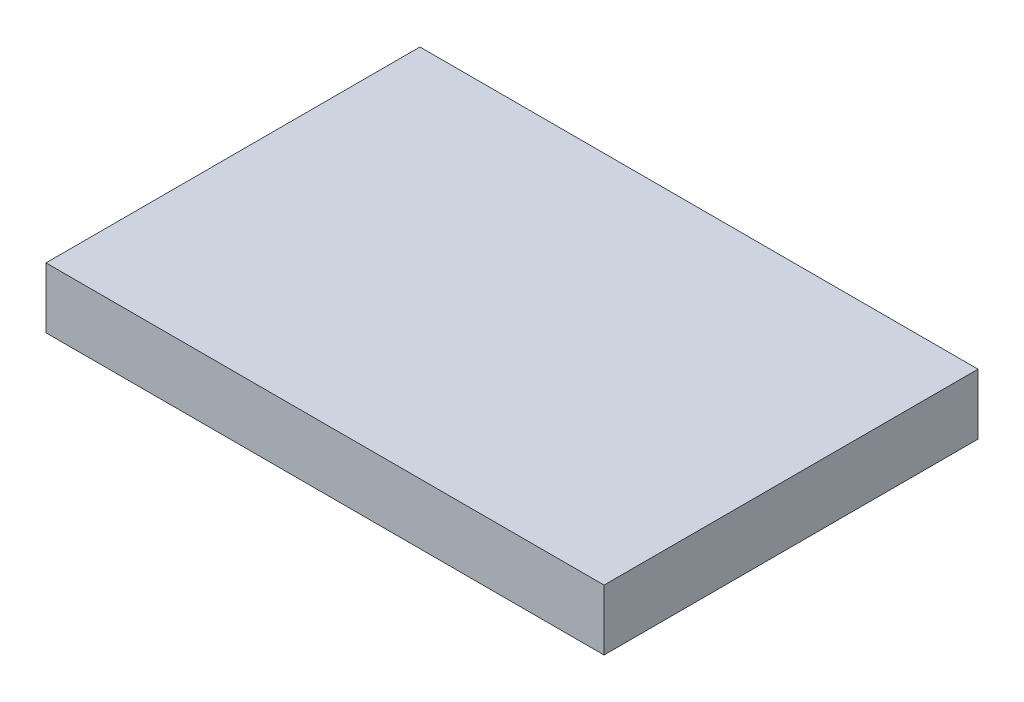
ISO-10303-21;
HEADER;
FILE_DESCRIPTION(('STEP AP214'),'2;1');
FILE_NAME('part.step','',(''),(''),'','','');
FILE_SCHEMA(('AUTOMOTIVE_DESIGN { 1 0 10303 214 1 1 1 1 }'));
ENDSEC;
DATA;
#1=APPLICATION_CONTEXT('core data for automotive mechanical design processes');
#2=APPLICATION_PROTOCOL_DEFINITION('international standard','automotive_design',2000,#1);
#3=PRODUCT_CONTEXT('',#1,'mechanical');
#4=PRODUCT('Part','Part','',(#3));
#5=PRODUCT_RELATED_PRODUCT_CATEGORY('part','',(#4));
#6=PRODUCT_DEFINITION_FORMATION('','',#4);
#7=PRODUCT_DEFINITION_CONTEXT('part definition',#1,'design');
#8=PRODUCT_DEFINITION('design','',#6,#7);
#9=PRODUCT_DEFINITION_SHAPE('','',#8);
#10=(LENGTH_UNIT() NAMED_UNIT(*) SI_UNIT(.MILLI.,.METRE.));
#11=(NAMED_UNIT(*) PLANE_ANGLE_UNIT() SI_UNIT($,.RADIAN.));
#12=(NAMED_UNIT(*) SI_UNIT($,.STERADIAN.) SOLID_ANGLE_UNIT());
#13=UNCERTAINTY_MEASURE_WITH_UNIT(LENGTH_MEASURE(1.E-05),#10,'distance_accuracy_value','');
#14=(GEOMETRIC_REPRESENTATION_CONTEXT(3) GLOBAL_UNCERTAINTY_ASSIGNED_CONTEXT((#13)) GLOBAL_UNIT_ASSIGNED_CONTEXT((#10,
#11,#12)) REPRESENTATION_CONTEXT('',''));
#15=CARTESIAN_POINT('',(0.,0.,0.));
#16=DIRECTION('',(0.,0.,1.));
#17=DIRECTION('',(1.,0.,0.));
#18=AXIS2_PLACEMENT_3D('',#15,#16,#17);
#19=CARTESIAN_POINT('',(41.45,9.,27.775));
#20=DIRECTION('',(-1.,0.,0.));
#21=DIRECTION('',(0.,0.,1.));
#22=AXIS2_PLACEMENT_3D('',#19,#20,#21);
#23=PLANE('',#22);
#24=DIRECTION('',(0.,0.,-1.));
#25=VECTOR('',#24,1.);
#26=CARTESIAN_POINT('',(41.45,0.,27.775));
#27=LINE('',#26,#25);
#28=CARTESIAN_POINT('',(41.45,0.,27.775));
#29=VERTEX_POINT('',#28);
#30=CARTESIAN_POINT('',(41.45,0.,-27.775));
#31=VERTEX_POINT('',#30);
#32=EDGE_CURVE('E111',#29,#31,#27,.T.);
#33=ORIENTED_EDGE('',*,*,#32,.T.);
#34=DIRECTION('',(0.,-1.,0.));
#35=VECTOR('',#34,1.);
#36=CARTESIAN_POINT('',(41.45,9.,-27.775));
#37=LINE('',#36,#35);
#38=CARTESIAN_POINT('',(41.45,9.,-27.775));
#39=VERTEX_POINT('',#38);
#40=EDGE_CURVE('E11',#39,#31,#37,.T.);
#41=ORIENTED_EDGE('',*,*,#40,.F.);
#42=DIRECTION('',(0.,0.,-1.));
#43=VECTOR('',#42,1.);
#44=CARTESIAN_POINT('',(41.45,9.,27.775));
#45=LINE('',#44,#43);
#46=CARTESIAN_POINT('',(41.45,9.,27.775));
#47=VERTEX_POINT('',#46);
#48=EDGE_CURVE('E95',#47,#39,#45,.T.);
#49=ORIENTED_EDGE('',*,*,#48,.F.);
#50=DIRECTION('',(0.,-1.,0.));
#51=VECTOR('',#50,1.);
#52=CARTESIAN_POINT('',(41.45,9.,27.775));
#53=LINE('',#52,#51);
#54=EDGE_CURVE('E107',#47,#29,#53,.T.);
#55=ORIENTED_EDGE('',*,*,#54,.T.);
#56=EDGE_LOOP('',(#33,#41,#49,#55));
#57=FACE_BOUND('',#56,.T.);
#58=ADVANCED_FACE('F43',(#57),#23,.F.);
#59=CARTESIAN_POINT('',(-41.45,9.,-27.775));
#60=DIRECTION('',(0.,0.,1.));
#61=DIRECTION('',(1.,0.,0.));
#62=AXIS2_PLACEMENT_3D('',#59,#60,#61);
#63=PLANE('',#62);
#64=DIRECTION('',(-1.,0.,0.));
#65=VECTOR('',#64,1.);
#66=CARTESIAN_POINT('',(-41.45,0.,-27.775));
#67=LINE('',#66,#65);
#68=CARTESIAN_POINT('',(-41.45,0.,-27.775));
#69=VERTEX_POINT('',#68);
#70=EDGE_CURVE('E100',#31,#69,#67,.T.);
#71=ORIENTED_EDGE('',*,*,#70,.T.);
#72=DIRECTION('',(0.,-1.,0.));
#73=VECTOR('',#72,1.);
#74=CARTESIAN_POINT('',(-41.45,9.,-27.775));
#75=LINE('',#74,#73);
#76=CARTESIAN_POINT('',(-41.45,9.,-27.775));
#77=VERTEX_POINT('',#76);
#78=EDGE_CURVE('E52',#77,#69,#75,.T.);
#79=ORIENTED_EDGE('',*,*,#78,.F.);
#80=DIRECTION('',(-1.,0.,0.));
#81=VECTOR('',#80,1.);
#82=CARTESIAN_POINT('',(-41.45,9.,-27.775));
#83=LINE('',#82,#81);
#84=EDGE_CURVE('E90',#39,#77,#83,.T.);
#85=ORIENTED_EDGE('',*,*,#84,.F.);
#86=ORIENTED_EDGE('',*,*,#40,.T.);
#87=EDGE_LOOP('',(#71,#79,#85,#86));
#88=FACE_BOUND('',#87,.T.);
#89=ADVANCED_FACE('F99',(#88),#63,.F.);
#90=CARTESIAN_POINT('',(-41.45,9.,27.775));
#91=DIRECTION('',(1.,0.,0.));
#92=DIRECTION('',(0.,0.,-1.));
#93=AXIS2_PLACEMENT_3D('',#90,#91,#92);
#94=PLANE('',#93);
#95=DIRECTION('',(0.,0.,1.));
#96=VECTOR('',#95,1.);
#97=CARTESIAN_POINT('',(-41.45,0.,27.775));
#98=LINE('',#97,#96);
#99=CARTESIAN_POINT('',(-41.45,0.,27.775));
#100=VERTEX_POINT('',#99);
#101=EDGE_CURVE('E77',#69,#100,#98,.T.);
#102=ORIENTED_EDGE('',*,*,#101,.T.);
#103=DIRECTION('',(0.,-1.,0.));
#104=VECTOR('',#103,1.);
#105=CARTESIAN_POINT('',(-41.45,9.,27.775));
#106=LINE('',#105,#104);
#107=CARTESIAN_POINT('',(-41.45,9.,27.775));
#108=VERTEX_POINT('',#107);
#109=EDGE_CURVE('E102',#108,#100,#106,.T.);
#110=ORIENTED_EDGE('',*,*,#109,.F.);
#111=DIRECTION('',(0.,0.,1.));
#112=VECTOR('',#111,1.);
#113=CARTESIAN_POINT('',(-41.45,9.,27.775));
#114=LINE('',#113,#112);
#115=EDGE_CURVE('E93',#77,#108,#114,.T.);
#116=ORIENTED_EDGE('',*,*,#115,.F.);
#117=ORIENTED_EDGE('',*,*,#78,.T.);
#118=EDGE_LOOP('',(#102,#110,#116,#117));
#119=FACE_BOUND('',#118,.T.);
#120=ADVANCED_FACE('F103',(#119),#94,.F.);
#121=CARTESIAN_POINT('',(-41.45,9.,27.775));
#122=DIRECTION('',(0.,0.,-1.));
#123=DIRECTION('',(-1.,0.,0.));
#124=AXIS2_PLACEMENT_3D('',#121,#122,#123);
#125=PLANE('',#124);
#126=DIRECTION('',(1.,0.,0.));
#127=VECTOR('',#126,1.);
#128=CARTESIAN_POINT('',(-41.45,0.,27.775));
#129=LINE('',#128,#127);
#130=EDGE_CURVE('E83',#100,#29,#129,.T.);
#131=ORIENTED_EDGE('',*,*,#130,.T.);
#132=ORIENTED_EDGE('',*,*,#54,.F.);
#133=DIRECTION('',(1.,0.,0.));
#134=VECTOR('',#133,1.);
#135=CARTESIAN_POINT('',(-41.45,9.,27.775));
#136=LINE('',#135,#134);
#137=EDGE_CURVE('E60',#108,#47,#136,.T.);
#138=ORIENTED_EDGE('',*,*,#137,.F.);
#139=ORIENTED_EDGE('',*,*,#109,.T.);
#140=EDGE_LOOP('',(#131,#132,#138,#139));
#141=FACE_BOUND('',#140,.T.);
#142=ADVANCED_FACE('F124',(#141),#125,.F.);
#143=CARTESIAN_POINT('',(0.,9.,0.));
#144=DIRECTION('',(0.,-1.,0.));
#145=DIRECTION('',(0.,0.,-1.));
#146=AXIS2_PLACEMENT_3D('',#143,#144,#145);
#147=PLANE('',#146);
#148=ORIENTED_EDGE('',*,*,#48,.T.);
#149=ORIENTED_EDGE('',*,*,#84,.T.);
#150=ORIENTED_EDGE('',*,*,#115,.T.);
#151=ORIENTED_EDGE('',*,*,#137,.T.);
#152=EDGE_LOOP('',(#148,#149,#150,#151));
#153=FACE_BOUND('',#152,.T.);
#154=ADVANCED_FACE('F91',(#153),#147,.F.);
#155=CARTESIAN_POINT('',(0.,0.,0.));
#156=DIRECTION('',(0.,-1.,0.));
#157=DIRECTION('',(0.,0.,-1.));
#158=AXIS2_PLACEMENT_3D('',#155,#156,#157);
#159=PLANE('',#158);
#160=ORIENTED_EDGE('',*,*,#32,.F.);
#161=ORIENTED_EDGE('',*,*,#130,.F.);
#162=ORIENTED_EDGE('',*,*,#101,.F.);
#163=ORIENTED_EDGE('',*,*,#70,.F.);
#164=EDGE_LOOP('',(#160,#161,#162,#163));
#165=FACE_BOUND('',#164,.T.);
#166=ADVANCED_FACE('F127',(#165),#159,.T.);
#167=CLOSED_SHELL('',(#58,#89,#120,#142,#154,#166));
#168=MANIFOLD_SOLID_BREP('B2',#167);
#169=ADVANCED_BREP_SHAPE_REPRESENTATION('',(#18,#168),#14);
#170=SHAPE_DEFINITION_REPRESENTATION(#9,#169);
ENDSEC;
END-ISO-10303-21;
